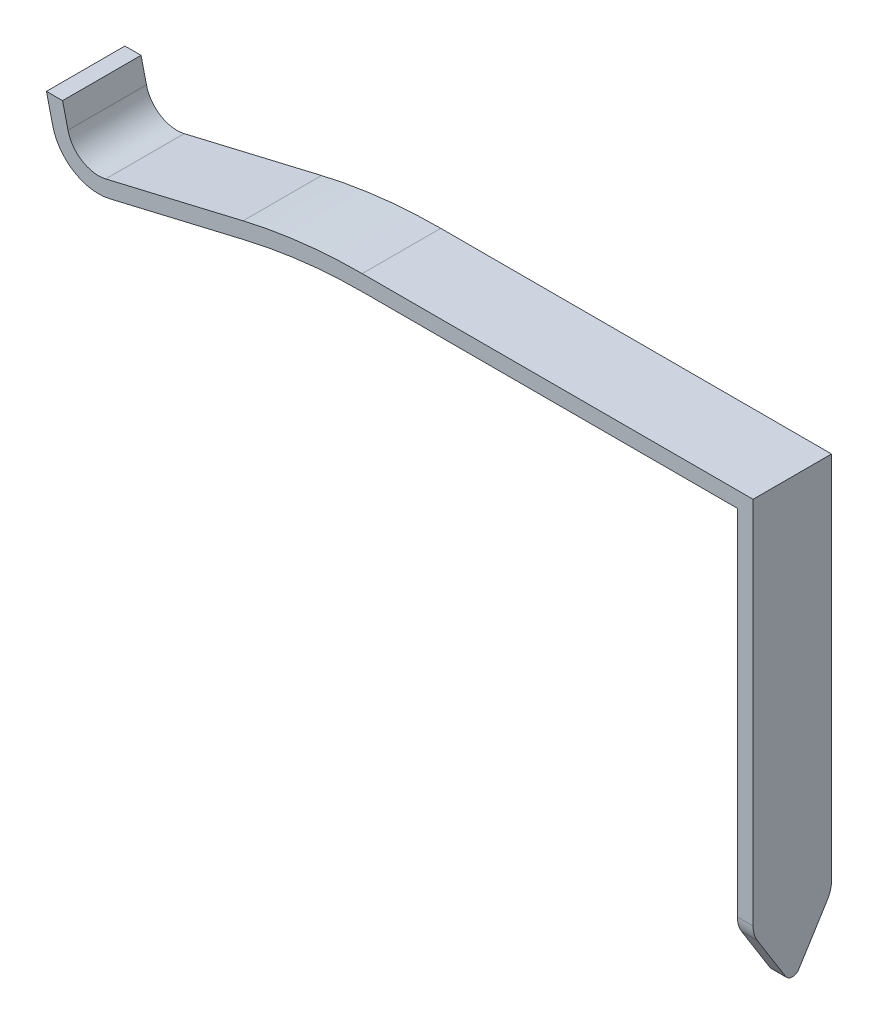
ISO-10303-21;
HEADER;
FILE_DESCRIPTION(('STEP AP214'),'2;1');
FILE_NAME('part.step','',(''),(''),'','','');
FILE_SCHEMA(('AUTOMOTIVE_DESIGN { 1 0 10303 214 1 1 1 1 }'));
ENDSEC;
DATA;
#1=APPLICATION_CONTEXT('core data for automotive mechanical design processes');
#2=APPLICATION_PROTOCOL_DEFINITION('international standard','automotive_design',2000,#1);
#3=PRODUCT_CONTEXT('',#1,'mechanical');
#4=PRODUCT('Part','Part','',(#3));
#5=PRODUCT_RELATED_PRODUCT_CATEGORY('part','',(#4));
#6=PRODUCT_DEFINITION_FORMATION('','',#4);
#7=PRODUCT_DEFINITION_CONTEXT('part definition',#1,'design');
#8=PRODUCT_DEFINITION('design','',#6,#7);
#9=PRODUCT_DEFINITION_SHAPE('','',#8);
#10=(LENGTH_UNIT() NAMED_UNIT(*) SI_UNIT(.MILLI.,.METRE.));
#11=(NAMED_UNIT(*) PLANE_ANGLE_UNIT() SI_UNIT($,.RADIAN.));
#12=(NAMED_UNIT(*) SI_UNIT($,.STERADIAN.) SOLID_ANGLE_UNIT());
#13=UNCERTAINTY_MEASURE_WITH_UNIT(LENGTH_MEASURE(1.E-05),#10,'distance_accuracy_value','');
#14=(GEOMETRIC_REPRESENTATION_CONTEXT(3) GLOBAL_UNCERTAINTY_ASSIGNED_CONTEXT((#13)) GLOBAL_UNIT_ASSIGNED_CONTEXT((#10,
#11,#12)) REPRESENTATION_CONTEXT('',''));
#15=CARTESIAN_POINT('',(0.,0.,0.));
#16=DIRECTION('',(0.,0.,1.));
#17=DIRECTION('',(1.,0.,0.));
#18=AXIS2_PLACEMENT_3D('',#15,#16,#17);
#19=CARTESIAN_POINT('',(-2.28021092385118,1.,0.));
#20=DIRECTION('',(0.,1.,0.));
#21=DIRECTION('',(0.,0.,1.));
#22=AXIS2_PLACEMENT_3D('',#19,#20,#21);
#23=PLANE('',#22);
#24=DIRECTION('',(1.,0.,0.));
#25=VECTOR('',#24,1.);
#26=CARTESIAN_POINT('',(-0.3202200276821,1.,-0.5));
#27=LINE('',#26,#25);
#28=CARTESIAN_POINT('',(2.7,1.,-0.5));
#29=VERTEX_POINT('',#28);
#30=CARTESIAN_POINT('',(-2.28021092385118,1.,-0.5));
#31=VERTEX_POINT('',#30);
#32=EDGE_CURVE('E245',#29,#31,#27,.F.);
#33=ORIENTED_EDGE('',*,*,#32,.T.);
#34=DIRECTION('',(0.,0.,1.));
#35=VECTOR('',#34,1.);
#36=CARTESIAN_POINT('',(-2.28021092385118,1.,0.));
#37=LINE('',#36,#35);
#38=CARTESIAN_POINT('',(-2.28021092385118,1.,0.5));
#39=VERTEX_POINT('',#38);
#40=EDGE_CURVE('E187',#39,#31,#37,.F.);
#41=ORIENTED_EDGE('',*,*,#40,.F.);
#42=DIRECTION('',(1.,0.,0.));
#43=VECTOR('',#42,1.);
#44=CARTESIAN_POINT('',(-0.3202200276821,1.,0.5));
#45=LINE('',#44,#43);
#46=CARTESIAN_POINT('',(2.7,1.,0.5));
#47=VERTEX_POINT('',#46);
#48=EDGE_CURVE('E234',#47,#39,#45,.F.);
#49=ORIENTED_EDGE('',*,*,#48,.F.);
#50=DIRECTION('',(0.,0.,1.));
#51=VECTOR('',#50,1.);
#52=CARTESIAN_POINT('',(2.7,1.,0.));
#53=LINE('',#52,#51);
#54=EDGE_CURVE('E190',#47,#29,#53,.F.);
#55=ORIENTED_EDGE('',*,*,#54,.T.);
#56=EDGE_LOOP('',(#33,#41,#49,#55));
#57=FACE_BOUND('',#56,.T.);
#58=ADVANCED_FACE('F16',(#57),#23,.T.);
#59=CARTESIAN_POINT('',(-2.28021092385118,-5.61694873292272,0.));
#60=DIRECTION('',(0.,0.,1.));
#61=DIRECTION('',(1.,0.,0.));
#62=AXIS2_PLACEMENT_3D('',#59,#60,#61);
#63=CYLINDRICAL_SURFACE('',#62,6.61694873292272);
#64=CARTESIAN_POINT('',(-2.28021092385118,-5.61694873292272,-0.5));
#65=DIRECTION('',(0.,0.,1.));
#66=DIRECTION('',(1.,0.,0.));
#67=AXIS2_PLACEMENT_3D('',#64,#65,#66);
#68=CIRCLE('',#67,6.61694873292272);
#69=CARTESIAN_POINT('',(-3.79920376767955,0.823289715653992,-0.5));
#70=VERTEX_POINT('',#69);
#71=EDGE_CURVE('E243',#31,#70,#68,.T.);
#72=ORIENTED_EDGE('',*,*,#71,.T.);
#73=DIRECTION('',(0.,0.,1.));
#74=VECTOR('',#73,1.);
#75=CARTESIAN_POINT('',(-3.79920376767955,0.823289715653993,0.));
#76=LINE('',#75,#74);
#77=CARTESIAN_POINT('',(-3.79920376767955,0.823289715653992,0.5));
#78=VERTEX_POINT('',#77);
#79=EDGE_CURVE('E184',#78,#70,#76,.F.);
#80=ORIENTED_EDGE('',*,*,#79,.F.);
#81=CARTESIAN_POINT('',(-2.28021092385118,-5.61694873292272,0.5));
#82=DIRECTION('',(0.,0.,1.));
#83=DIRECTION('',(1.,0.,0.));
#84=AXIS2_PLACEMENT_3D('',#81,#82,#83);
#85=CIRCLE('',#84,6.61694873292272);
#86=EDGE_CURVE('E231',#39,#78,#85,.T.);
#87=ORIENTED_EDGE('',*,*,#86,.F.);
#88=ORIENTED_EDGE('',*,*,#40,.T.);
#89=EDGE_LOOP('',(#72,#80,#87,#88));
#90=FACE_BOUND('',#89,.T.);
#91=ADVANCED_FACE('F377',(#90),#63,.T.);
#92=CARTESIAN_POINT('',(-5.54858018365606,0.410682282210637,0.));
#93=DIRECTION('',(-0.229560920771625,0.973294294473405,0.));
#94=DIRECTION('',(-0.973294294473405,-0.229560920771625,0.));
#95=AXIS2_PLACEMENT_3D('',#92,#93,#94);
#96=PLANE('',#95);
#97=DIRECTION('',(-0.973294294473405,-0.229560920771625,0.));
#98=VECTOR('',#97,1.);
#99=CARTESIAN_POINT('',(-3.79920376767955,0.823289715653993,-0.5));
#100=LINE('',#99,#98);
#101=CARTESIAN_POINT('',(-5.54858018365606,0.410682282210637,-0.5));
#102=VERTEX_POINT('',#101);
#103=EDGE_CURVE('E242',#70,#102,#100,.T.);
#104=ORIENTED_EDGE('',*,*,#103,.T.);
#105=DIRECTION('',(0.,0.,1.));
#106=VECTOR('',#105,1.);
#107=CARTESIAN_POINT('',(-5.54858018365606,0.410682282210638,0.));
#108=LINE('',#107,#106);
#109=CARTESIAN_POINT('',(-5.54858018365606,0.410682282210637,0.5));
#110=VERTEX_POINT('',#109);
#111=EDGE_CURVE('E182',#102,#110,#108,.T.);
#112=ORIENTED_EDGE('',*,*,#111,.T.);
#113=DIRECTION('',(-0.973294294473405,-0.229560920771625,0.));
#114=VECTOR('',#113,1.);
#115=CARTESIAN_POINT('',(-3.79920376767955,0.823289715653993,0.5));
#116=LINE('',#115,#114);
#117=EDGE_CURVE('E230',#78,#110,#116,.T.);
#118=ORIENTED_EDGE('',*,*,#117,.F.);
#119=ORIENTED_EDGE('',*,*,#79,.T.);
#120=EDGE_LOOP('',(#104,#112,#118,#119));
#121=FACE_BOUND('',#120,.T.);
#122=ADVANCED_FACE('F374',(#121),#96,.T.);
#123=CARTESIAN_POINT('',(-5.64040455196471,0.8,0.));
#124=DIRECTION('',(0.,0.,1.));
#125=DIRECTION('',(1.,0.,0.));
#126=AXIS2_PLACEMENT_3D('',#123,#124,#125);
#127=CYLINDRICAL_SURFACE('',#126,0.4);
#128=ORIENTED_EDGE('',*,*,#111,.F.);
#129=CARTESIAN_POINT('',(-5.64040455196471,0.8,-0.5));
#130=DIRECTION('',(0.,0.,1.));
#131=DIRECTION('',(1.,0.,0.));
#132=AXIS2_PLACEMENT_3D('',#129,#130,#131);
#133=CIRCLE('',#132,0.4);
#134=CARTESIAN_POINT('',(-6.02972226975407,0.70817563169135,-0.5));
#135=VERTEX_POINT('',#134);
#136=EDGE_CURVE('E240',#102,#135,#133,.F.);
#137=ORIENTED_EDGE('',*,*,#136,.T.);
#138=DIRECTION('',(0.,0.,1.));
#139=VECTOR('',#138,1.);
#140=CARTESIAN_POINT('',(-6.02972226975407,0.708175631691351,0.));
#141=LINE('',#140,#139);
#142=CARTESIAN_POINT('',(-6.02972226975407,0.70817563169135,0.5));
#143=VERTEX_POINT('',#142);
#144=EDGE_CURVE('E177',#143,#135,#141,.F.);
#145=ORIENTED_EDGE('',*,*,#144,.F.);
#146=CARTESIAN_POINT('',(-5.64040455196471,0.8,0.5));
#147=DIRECTION('',(0.,0.,1.));
#148=DIRECTION('',(1.,0.,0.));
#149=AXIS2_PLACEMENT_3D('',#146,#147,#148);
#150=CIRCLE('',#149,0.4);
#151=EDGE_CURVE('E227',#110,#143,#150,.F.);
#152=ORIENTED_EDGE('',*,*,#151,.F.);
#153=EDGE_LOOP('',(#128,#137,#145,#152));
#154=FACE_BOUND('',#153,.T.);
#155=ADVANCED_FACE('F370',(#154),#127,.F.);
#156=CARTESIAN_POINT('',(-6.09855188385222,1.,0.));
#157=DIRECTION('',(0.973294294473405,0.229560920771626,0.));
#158=DIRECTION('',(-0.229560920771626,0.973294294473405,0.));
#159=AXIS2_PLACEMENT_3D('',#156,#157,#158);
#160=PLANE('',#159);
#161=DIRECTION('',(-0.229560920771626,0.973294294473405,0.));
#162=VECTOR('',#161,1.);
#163=CARTESIAN_POINT('',(-6.02972226975407,0.708175631691351,-0.5));
#164=LINE('',#163,#162);
#165=CARTESIAN_POINT('',(-6.09855188385222,1.,-0.5));
#166=VERTEX_POINT('',#165);
#167=EDGE_CURVE('E205',#135,#166,#164,.T.);
#168=ORIENTED_EDGE('',*,*,#167,.T.);
#169=DIRECTION('',(0.,0.,1.));
#170=VECTOR('',#169,1.);
#171=CARTESIAN_POINT('',(-6.09855188385222,1.,0.));
#172=LINE('',#171,#170);
#173=CARTESIAN_POINT('',(-6.09855188385222,1.,0.5));
#174=VERTEX_POINT('',#173);
#175=EDGE_CURVE('E165',#174,#166,#172,.F.);
#176=ORIENTED_EDGE('',*,*,#175,.F.);
#177=DIRECTION('',(-0.229560920771626,0.973294294473405,0.));
#178=VECTOR('',#177,1.);
#179=CARTESIAN_POINT('',(-6.02972226975407,0.708175631691351,0.5));
#180=LINE('',#179,#178);
#181=EDGE_CURVE('E172',#143,#174,#180,.T.);
#182=ORIENTED_EDGE('',*,*,#181,.F.);
#183=ORIENTED_EDGE('',*,*,#144,.T.);
#184=EDGE_LOOP('',(#168,#176,#182,#183));
#185=FACE_BOUND('',#184,.T.);
#186=ADVANCED_FACE('F365',(#185),#160,.T.);
#187=CARTESIAN_POINT('',(-6.30403957769327,1.,0.));
#188=DIRECTION('',(0.,1.,0.));
#189=DIRECTION('',(0.,0.,1.));
#190=AXIS2_PLACEMENT_3D('',#187,#188,#189);
#191=PLANE('',#190);
#192=DIRECTION('',(1.,0.,0.));
#193=VECTOR('',#192,1.);
#194=CARTESIAN_POINT('',(-0.3202200276821,1.,-0.5));
#195=LINE('',#194,#193);
#196=CARTESIAN_POINT('',(-6.30403957769327,1.,-0.5));
#197=VERTEX_POINT('',#196);
#198=EDGE_CURVE('E201',#166,#197,#195,.F.);
#199=ORIENTED_EDGE('',*,*,#198,.T.);
#200=DIRECTION('',(0.,0.,1.));
#201=VECTOR('',#200,1.);
#202=CARTESIAN_POINT('',(-6.30403957769327,1.,0.));
#203=LINE('',#202,#201);
#204=CARTESIAN_POINT('',(-6.30403957769327,1.,0.5));
#205=VERTEX_POINT('',#204);
#206=EDGE_CURVE('E162',#205,#197,#203,.F.);
#207=ORIENTED_EDGE('',*,*,#206,.F.);
#208=DIRECTION('',(1.,0.,0.));
#209=VECTOR('',#208,1.);
#210=CARTESIAN_POINT('',(-0.3202200276821,1.,0.5));
#211=LINE('',#210,#209);
#212=EDGE_CURVE('E168',#174,#205,#211,.F.);
#213=ORIENTED_EDGE('',*,*,#212,.F.);
#214=ORIENTED_EDGE('',*,*,#175,.T.);
#215=EDGE_LOOP('',(#199,#207,#213,#214));
#216=FACE_BOUND('',#215,.T.);
#217=ADVANCED_FACE('F362',(#216),#191,.T.);
#218=CARTESIAN_POINT('',(-6.22438112864875,0.662263447537025,0.));
#219=DIRECTION('',(-0.973294294473407,-0.229560920771619,0.));
#220=DIRECTION('',(0.229560920771619,-0.973294294473407,0.));
#221=AXIS2_PLACEMENT_3D('',#218,#219,#220);
#222=PLANE('',#221);
#223=DIRECTION('',(0.229560920771617,-0.973294294473407,0.));
#224=VECTOR('',#223,1.);
#225=CARTESIAN_POINT('',(-6.30403957769327,1.,-0.5));
#226=LINE('',#225,#224);
#227=CARTESIAN_POINT('',(-6.22438112864875,0.662263447537028,-0.5));
#228=VERTEX_POINT('',#227);
#229=EDGE_CURVE('E204',#197,#228,#226,.T.);
#230=ORIENTED_EDGE('',*,*,#229,.T.);
#231=DIRECTION('',(0.,0.,1.));
#232=VECTOR('',#231,1.);
#233=CARTESIAN_POINT('',(-6.22438112864875,0.662263447537025,0.));
#234=LINE('',#233,#232);
#235=CARTESIAN_POINT('',(-6.22438112864875,0.662263447537028,0.5));
#236=VERTEX_POINT('',#235);
#237=EDGE_CURVE('E159',#236,#228,#234,.F.);
#238=ORIENTED_EDGE('',*,*,#237,.F.);
#239=DIRECTION('',(0.229560920771617,-0.973294294473407,0.));
#240=VECTOR('',#239,1.);
#241=CARTESIAN_POINT('',(-6.30403957769327,1.,0.5));
#242=LINE('',#241,#240);
#243=EDGE_CURVE('E171',#205,#236,#242,.T.);
#244=ORIENTED_EDGE('',*,*,#243,.F.);
#245=ORIENTED_EDGE('',*,*,#206,.T.);
#246=EDGE_LOOP('',(#230,#238,#244,#245));
#247=FACE_BOUND('',#246,.T.);
#248=ADVANCED_FACE('F358',(#247),#222,.T.);
#249=CARTESIAN_POINT('',(-5.64040455196471,0.8,0.));
#250=DIRECTION('',(0.,0.,1.));
#251=DIRECTION('',(1.,0.,0.));
#252=AXIS2_PLACEMENT_3D('',#249,#250,#251);
#253=CYLINDRICAL_SURFACE('',#252,0.6);
#254=CARTESIAN_POINT('',(-5.64040455196471,0.8,-0.5));
#255=DIRECTION('',(0.,0.,1.));
#256=DIRECTION('',(1.,0.,0.));
#257=AXIS2_PLACEMENT_3D('',#254,#255,#256);
#258=CIRCLE('',#257,0.6);
#259=CARTESIAN_POINT('',(-5.50266799950174,0.216023423315956,-0.5));
#260=VERTEX_POINT('',#259);
#261=EDGE_CURVE('E238',#228,#260,#258,.T.);
#262=ORIENTED_EDGE('',*,*,#261,.T.);
#263=DIRECTION('',(0.,0.,1.));
#264=VECTOR('',#263,1.);
#265=CARTESIAN_POINT('',(-5.50266799950174,0.216023423315956,0.));
#266=LINE('',#265,#264);
#267=CARTESIAN_POINT('',(-5.50266799950174,0.216023423315956,0.5));
#268=VERTEX_POINT('',#267);
#269=EDGE_CURVE('E156',#268,#260,#266,.F.);
#270=ORIENTED_EDGE('',*,*,#269,.F.);
#271=CARTESIAN_POINT('',(-5.64040455196471,0.8,0.5));
#272=DIRECTION('',(0.,0.,1.));
#273=DIRECTION('',(1.,0.,0.));
#274=AXIS2_PLACEMENT_3D('',#271,#272,#273);
#275=CIRCLE('',#274,0.6);
#276=EDGE_CURVE('E224',#236,#268,#275,.T.);
#277=ORIENTED_EDGE('',*,*,#276,.F.);
#278=ORIENTED_EDGE('',*,*,#237,.T.);
#279=EDGE_LOOP('',(#262,#270,#277,#278));
#280=FACE_BOUND('',#279,.T.);
#281=ADVANCED_FACE('F353',(#280),#253,.T.);
#282=CARTESIAN_POINT('',(-3.7740451176535,0.623735933989494,0.));
#283=DIRECTION('',(0.229560920771625,-0.973294294473405,0.));
#284=DIRECTION('',(0.973294294473405,0.229560920771625,0.));
#285=AXIS2_PLACEMENT_3D('',#282,#283,#284);
#286=PLANE('',#285);
#287=DIRECTION('',(0.973294294473405,0.229560920771625,0.));
#288=VECTOR('',#287,1.);
#289=CARTESIAN_POINT('',(-5.50266799950174,0.216023423315956,-0.5));
#290=LINE('',#289,#288);
#291=CARTESIAN_POINT('',(-3.7740451176535,0.623735933989495,-0.5));
#292=VERTEX_POINT('',#291);
#293=EDGE_CURVE('E237',#260,#292,#290,.T.);
#294=ORIENTED_EDGE('',*,*,#293,.T.);
#295=DIRECTION('',(0.,0.,1.));
#296=VECTOR('',#295,1.);
#297=CARTESIAN_POINT('',(-3.7740451176535,0.623735933989495,0.));
#298=LINE('',#297,#296);
#299=CARTESIAN_POINT('',(-3.7740451176535,0.623735933989495,0.5));
#300=VERTEX_POINT('',#299);
#301=EDGE_CURVE('E146',#292,#300,#298,.T.);
#302=ORIENTED_EDGE('',*,*,#301,.T.);
#303=DIRECTION('',(0.973294294473405,0.229560920771625,0.));
#304=VECTOR('',#303,1.);
#305=CARTESIAN_POINT('',(-5.50266799950174,0.216023423315956,0.5));
#306=LINE('',#305,#304);
#307=EDGE_CURVE('E223',#268,#300,#306,.T.);
#308=ORIENTED_EDGE('',*,*,#307,.F.);
#309=ORIENTED_EDGE('',*,*,#269,.T.);
#310=EDGE_LOOP('',(#294,#302,#308,#309));
#311=FACE_BOUND('',#310,.T.);
#312=ADVANCED_FACE('F350',(#311),#286,.T.);
#313=CARTESIAN_POINT('',(-2.25888794451583,-5.80024000620294,0.));
#314=DIRECTION('',(0.,0.,1.));
#315=DIRECTION('',(1.,0.,0.));
#316=AXIS2_PLACEMENT_3D('',#313,#314,#315);
#317=CYLINDRICAL_SURFACE('',#316,6.60024000620294);
#318=ORIENTED_EDGE('',*,*,#301,.F.);
#319=CARTESIAN_POINT('',(-2.25888794451583,-5.80024000620294,-0.5));
#320=DIRECTION('',(0.,0.,1.));
#321=DIRECTION('',(1.,0.,0.));
#322=AXIS2_PLACEMENT_3D('',#319,#320,#321);
#323=CIRCLE('',#322,6.60024000620294);
#324=CARTESIAN_POINT('',(-2.25888794451583,0.8,-0.5));
#325=VERTEX_POINT('',#324);
#326=EDGE_CURVE('E235',#292,#325,#323,.F.);
#327=ORIENTED_EDGE('',*,*,#326,.T.);
#328=DIRECTION('',(0.,0.,-1.));
#329=VECTOR('',#328,1.);
#330=CARTESIAN_POINT('',(-2.25888794451583,0.8,0.));
#331=LINE('',#330,#329);
#332=CARTESIAN_POINT('',(-2.25888794451583,0.8,0.5));
#333=VERTEX_POINT('',#332);
#334=EDGE_CURVE('E143',#333,#325,#331,.T.);
#335=ORIENTED_EDGE('',*,*,#334,.F.);
#336=CARTESIAN_POINT('',(-2.25888794451583,-5.80024000620294,0.5));
#337=DIRECTION('',(0.,0.,1.));
#338=DIRECTION('',(1.,0.,0.));
#339=AXIS2_PLACEMENT_3D('',#336,#337,#338);
#340=CIRCLE('',#339,6.60024000620294);
#341=EDGE_CURVE('E219',#300,#333,#340,.F.);
#342=ORIENTED_EDGE('',*,*,#341,.F.);
#343=EDGE_LOOP('',(#318,#327,#335,#342));
#344=FACE_BOUND('',#343,.T.);
#345=ADVANCED_FACE('F346',(#344),#317,.F.);
#346=CARTESIAN_POINT('',(2.5,0.8,0.));
#347=DIRECTION('',(0.,-1.,0.));
#348=DIRECTION('',(0.,0.,-1.));
#349=AXIS2_PLACEMENT_3D('',#346,#347,#348);
#350=PLANE('',#349);
#351=DIRECTION('',(1.,0.,0.));
#352=VECTOR('',#351,1.);
#353=CARTESIAN_POINT('',(-0.3202200276821,0.8,-0.5));
#354=LINE('',#353,#352);
#355=CARTESIAN_POINT('',(2.5,0.8,-0.5));
#356=VERTEX_POINT('',#355);
#357=EDGE_CURVE('E198',#325,#356,#354,.T.);
#358=ORIENTED_EDGE('',*,*,#357,.T.);
#359=DIRECTION('',(0.,0.,1.));
#360=VECTOR('',#359,1.);
#361=CARTESIAN_POINT('',(2.5,0.8,0.));
#362=LINE('',#361,#360);
#363=CARTESIAN_POINT('',(2.5,0.8,0.5));
#364=VERTEX_POINT('',#363);
#365=EDGE_CURVE('E150',#364,#356,#362,.F.);
#366=ORIENTED_EDGE('',*,*,#365,.F.);
#367=DIRECTION('',(1.,0.,0.));
#368=VECTOR('',#367,1.);
#369=CARTESIAN_POINT('',(-0.3202200276821,0.8,0.5));
#370=LINE('',#369,#368);
#371=EDGE_CURVE('E222',#333,#364,#370,.T.);
#372=ORIENTED_EDGE('',*,*,#371,.F.);
#373=ORIENTED_EDGE('',*,*,#334,.T.);
#374=EDGE_LOOP('',(#358,#366,#372,#373));
#375=FACE_BOUND('',#374,.T.);
#376=ADVANCED_FACE('F340',(#375),#350,.T.);
#377=CARTESIAN_POINT('',(2.5,-4.61,0.));
#378=DIRECTION('',(-1.,0.,0.));
#379=DIRECTION('',(0.,0.,1.));
#380=AXIS2_PLACEMENT_3D('',#377,#378,#379);
#381=PLANE('',#380);
#382=ORIENTED_EDGE('',*,*,#365,.T.);
#383=DIRECTION('',(0.,1.,0.));
#384=VECTOR('',#383,1.);
#385=CARTESIAN_POINT('',(2.5,-0.224915035415514,-0.5));
#386=LINE('',#385,#384);
#387=CARTESIAN_POINT('',(2.5,-3.70962132075604,-0.5));
#388=VERTEX_POINT('',#387);
#389=EDGE_CURVE('E195',#356,#388,#386,.F.);
#390=ORIENTED_EDGE('',*,*,#389,.T.);
#391=CARTESIAN_POINT('',(2.5,-3.70962132075604,-0.15));
#392=DIRECTION('',(-1.,0.,0.));
#393=DIRECTION('',(0.,0.,1.));
#394=AXIS2_PLACEMENT_3D('',#391,#392,#393);
#395=CIRCLE('',#394,0.35);
#396=CARTESIAN_POINT('',(2.5,-3.89512094975715,-0.446799406401781));
#397=VERTEX_POINT('',#396);
#398=EDGE_CURVE('E152',#397,#388,#395,.F.);
#399=ORIENTED_EDGE('',*,*,#398,.F.);
#400=DIRECTION('',(0.,-0.847998304005088,0.52999894000318));
#401=VECTOR('',#400,1.);
#402=CARTESIAN_POINT('',(2.5,-3.89512094975715,-0.446799406401781));
#403=LINE('',#402,#401);
#404=CARTESIAN_POINT('',(2.5,-4.47432027135919,-0.0847998304005089));
#405=VERTEX_POINT('',#404);
#406=EDGE_CURVE('E142',#397,#405,#403,.T.);
#407=ORIENTED_EDGE('',*,*,#406,.T.);
#408=CARTESIAN_POINT('',(2.5,-4.42132037735887,0.));
#409=DIRECTION('',(-1.,0.,0.));
#410=DIRECTION('',(0.,0.,1.));
#411=AXIS2_PLACEMENT_3D('',#408,#409,#410);
#412=CIRCLE('',#411,0.1);
#413=CARTESIAN_POINT('',(2.5,-4.47432027135919,0.0847998304005086));
#414=VERTEX_POINT('',#413);
#415=EDGE_CURVE('E19',#405,#414,#412,.T.);
#416=ORIENTED_EDGE('',*,*,#415,.T.);
#417=DIRECTION('',(0.,0.847998304005088,0.52999894000318));
#418=VECTOR('',#417,1.);
#419=CARTESIAN_POINT('',(2.5,-4.47432027135919,0.084799830400509));
#420=LINE('',#419,#418);
#421=CARTESIAN_POINT('',(2.5,-3.89512094975715,0.446799406401781));
#422=VERTEX_POINT('',#421);
#423=EDGE_CURVE('E126',#414,#422,#420,.T.);
#424=ORIENTED_EDGE('',*,*,#423,.T.);
#425=CARTESIAN_POINT('',(2.5,-3.70962132075604,0.15));
#426=DIRECTION('',(1.,0.,0.));
#427=DIRECTION('',(0.,0.,-1.));
#428=AXIS2_PLACEMENT_3D('',#425,#426,#427);
#429=CIRCLE('',#428,0.35);
#430=CARTESIAN_POINT('',(2.5,-3.70962132075604,0.5));
#431=VERTEX_POINT('',#430);
#432=EDGE_CURVE('E132',#422,#431,#429,.F.);
#433=ORIENTED_EDGE('',*,*,#432,.T.);
#434=DIRECTION('',(0.,1.,0.));
#435=VECTOR('',#434,1.);
#436=CARTESIAN_POINT('',(2.5,-0.224915035415514,0.5));
#437=LINE('',#436,#435);
#438=EDGE_CURVE('E249',#364,#431,#437,.F.);
#439=ORIENTED_EDGE('',*,*,#438,.F.);
#440=EDGE_LOOP('',(#382,#390,#399,#407,#416,#424,#433,#439));
#441=FACE_BOUND('',#440,.T.);
#442=ADVANCED_FACE('F140',(#441),#381,.T.);
#443=CARTESIAN_POINT('',(1.08988998615895,-3.70962132075604,-0.15));
#444=DIRECTION('',(-1.,0.,0.));
#445=DIRECTION('',(0.,0.,1.));
#446=AXIS2_PLACEMENT_3D('',#443,#444,#445);
#447=CYLINDRICAL_SURFACE('',#446,0.35);
#448=CARTESIAN_POINT('',(2.7,-3.70962132075604,-0.15));
#449=DIRECTION('',(-1.,0.,0.));
#450=DIRECTION('',(0.,0.,1.));
#451=AXIS2_PLACEMENT_3D('',#448,#449,#450);
#452=CIRCLE('',#451,0.35);
#453=CARTESIAN_POINT('',(2.7,-3.89512094975715,-0.446799406401781));
#454=VERTEX_POINT('',#453);
#455=CARTESIAN_POINT('',(2.7,-3.70962132075604,-0.5));
#456=VERTEX_POINT('',#455);
#457=EDGE_CURVE('E214',#454,#456,#452,.F.);
#458=ORIENTED_EDGE('',*,*,#457,.F.);
#459=DIRECTION('',(1.,0.,0.));
#460=VECTOR('',#459,1.);
#461=CARTESIAN_POINT('',(2.5,-3.89512094975715,-0.446799406401781));
#462=LINE('',#461,#460);
#463=EDGE_CURVE('E218',#454,#397,#462,.F.);
#464=ORIENTED_EDGE('',*,*,#463,.T.);
#465=ORIENTED_EDGE('',*,*,#398,.T.);
#466=DIRECTION('',(1.,0.,0.));
#467=VECTOR('',#466,1.);
#468=CARTESIAN_POINT('',(-0.3202200276821,-3.70962132075604,-0.5));
#469=LINE('',#468,#467);
#470=EDGE_CURVE('E197',#388,#456,#469,.T.);
#471=ORIENTED_EDGE('',*,*,#470,.T.);
#472=EDGE_LOOP('',(#458,#464,#465,#471));
#473=FACE_BOUND('',#472,.T.);
#474=ADVANCED_FACE('F304',(#473),#447,.T.);
#475=CARTESIAN_POINT('',(-0.3202200276821,-0.224915035415514,-0.5));
#476=DIRECTION('',(0.,0.,1.));
#477=DIRECTION('',(1.,0.,0.));
#478=AXIS2_PLACEMENT_3D('',#475,#476,#477);
#479=PLANE('',#478);
#480=ORIENTED_EDGE('',*,*,#389,.F.);
#481=ORIENTED_EDGE('',*,*,#357,.F.);
#482=ORIENTED_EDGE('',*,*,#326,.F.);
#483=ORIENTED_EDGE('',*,*,#293,.F.);
#484=ORIENTED_EDGE('',*,*,#261,.F.);
#485=ORIENTED_EDGE('',*,*,#229,.F.);
#486=ORIENTED_EDGE('',*,*,#198,.F.);
#487=ORIENTED_EDGE('',*,*,#167,.F.);
#488=ORIENTED_EDGE('',*,*,#136,.F.);
#489=ORIENTED_EDGE('',*,*,#103,.F.);
#490=ORIENTED_EDGE('',*,*,#71,.F.);
#491=ORIENTED_EDGE('',*,*,#32,.F.);
#492=DIRECTION('',(0.,1.,0.));
#493=VECTOR('',#492,1.);
#494=CARTESIAN_POINT('',(2.7,1.,-0.5));
#495=LINE('',#494,#493);
#496=EDGE_CURVE('E217',#456,#29,#495,.T.);
#497=ORIENTED_EDGE('',*,*,#496,.F.);
#498=ORIENTED_EDGE('',*,*,#470,.F.);
#499=EDGE_LOOP('',(#480,#481,#482,#483,#484,#485,#486,#487,#488,#489,#490,#491,#497,#498));
#500=FACE_BOUND('',#499,.T.);
#501=ADVANCED_FACE('F311',(#500),#479,.F.);
#502=CARTESIAN_POINT('',(-0.3202200276821,-0.224915035415514,0.5));
#503=DIRECTION('',(0.,0.,1.));
#504=DIRECTION('',(1.,0.,0.));
#505=AXIS2_PLACEMENT_3D('',#502,#503,#504);
#506=PLANE('',#505);
#507=ORIENTED_EDGE('',*,*,#371,.T.);
#508=ORIENTED_EDGE('',*,*,#438,.T.);
#509=DIRECTION('',(1.,0.,0.));
#510=VECTOR('',#509,1.);
#511=CARTESIAN_POINT('',(1.08988998615895,-3.70962132075604,0.5));
#512=LINE('',#511,#510);
#513=CARTESIAN_POINT('',(2.7,-3.70962132075604,0.5));
#514=VERTEX_POINT('',#513);
#515=EDGE_CURVE('E256',#514,#431,#512,.F.);
#516=ORIENTED_EDGE('',*,*,#515,.F.);
#517=DIRECTION('',(0.,1.,0.));
#518=VECTOR('',#517,1.);
#519=CARTESIAN_POINT('',(2.7,1.,0.5));
#520=LINE('',#519,#518);
#521=EDGE_CURVE('E213',#47,#514,#520,.F.);
#522=ORIENTED_EDGE('',*,*,#521,.F.);
#523=ORIENTED_EDGE('',*,*,#48,.T.);
#524=ORIENTED_EDGE('',*,*,#86,.T.);
#525=ORIENTED_EDGE('',*,*,#117,.T.);
#526=ORIENTED_EDGE('',*,*,#151,.T.);
#527=ORIENTED_EDGE('',*,*,#181,.T.);
#528=ORIENTED_EDGE('',*,*,#212,.T.);
#529=ORIENTED_EDGE('',*,*,#243,.T.);
#530=ORIENTED_EDGE('',*,*,#276,.T.);
#531=ORIENTED_EDGE('',*,*,#307,.T.);
#532=ORIENTED_EDGE('',*,*,#341,.T.);
#533=EDGE_LOOP('',(#507,#508,#516,#522,#523,#524,#525,#526,#527,#528,#529,#530,#531,#532));
#534=FACE_BOUND('',#533,.T.);
#535=ADVANCED_FACE('F254',(#534),#506,.T.);
#536=CARTESIAN_POINT('',(1.08988998615895,-3.70962132075604,0.15));
#537=DIRECTION('',(1.,0.,0.));
#538=DIRECTION('',(0.,0.,-1.));
#539=AXIS2_PLACEMENT_3D('',#536,#537,#538);
#540=CYLINDRICAL_SURFACE('',#539,0.35);
#541=ORIENTED_EDGE('',*,*,#432,.F.);
#542=DIRECTION('',(1.,0.,0.));
#543=VECTOR('',#542,1.);
#544=CARTESIAN_POINT('',(2.5,-3.89512094975715,0.446799406401781));
#545=LINE('',#544,#543);
#546=CARTESIAN_POINT('',(2.7,-3.89512094975715,0.446799406401781));
#547=VERTEX_POINT('',#546);
#548=EDGE_CURVE('E130',#422,#547,#545,.T.);
#549=ORIENTED_EDGE('',*,*,#548,.T.);
#550=CARTESIAN_POINT('',(2.7,-3.70962132075604,0.15));
#551=DIRECTION('',(1.,0.,0.));
#552=DIRECTION('',(0.,0.,-1.));
#553=AXIS2_PLACEMENT_3D('',#550,#551,#552);
#554=CIRCLE('',#553,0.35);
#555=EDGE_CURVE('E210',#514,#547,#554,.T.);
#556=ORIENTED_EDGE('',*,*,#555,.F.);
#557=ORIENTED_EDGE('',*,*,#515,.T.);
#558=EDGE_LOOP('',(#541,#549,#556,#557));
#559=FACE_BOUND('',#558,.T.);
#560=ADVANCED_FACE('F260',(#559),#540,.T.);
#561=CARTESIAN_POINT('',(2.5,-3.81,0.5));
#562=DIRECTION('',(0.,0.52999894000318,-0.847998304005088));
#563=DIRECTION('',(0.,0.847998304005088,0.52999894000318));
#564=AXIS2_PLACEMENT_3D('',#561,#562,#563);
#565=PLANE('',#564);
#566=ORIENTED_EDGE('',*,*,#423,.F.);
#567=DIRECTION('',(-1.,0.,0.));
#568=VECTOR('',#567,1.);
#569=CARTESIAN_POINT('',(2.5,-4.47432027135919,0.0847998304005083));
#570=LINE('',#569,#568);
#571=CARTESIAN_POINT('',(2.7,-4.47432027135919,0.0847998304005084));
#572=VERTEX_POINT('',#571);
#573=EDGE_CURVE('E129',#572,#414,#570,.T.);
#574=ORIENTED_EDGE('',*,*,#573,.F.);
#575=DIRECTION('',(0.,-0.847998304005087,-0.529998940003181));
#576=VECTOR('',#575,1.);
#577=CARTESIAN_POINT('',(2.7,-3.89512094975715,0.446799406401781));
#578=LINE('',#577,#576);
#579=EDGE_CURVE('E209',#547,#572,#578,.T.);
#580=ORIENTED_EDGE('',*,*,#579,.F.);
#581=ORIENTED_EDGE('',*,*,#548,.F.);
#582=EDGE_LOOP('',(#566,#574,#580,#581));
#583=FACE_BOUND('',#582,.T.);
#584=ADVANCED_FACE('F127',(#583),#565,.F.);
#585=CARTESIAN_POINT('',(2.5,-4.42132037735887,0.));
#586=DIRECTION('',(-1.,0.,0.));
#587=DIRECTION('',(0.,0.,1.));
#588=AXIS2_PLACEMENT_3D('',#585,#586,#587);
#589=CYLINDRICAL_SURFACE('',#588,0.1);
#590=CARTESIAN_POINT('',(2.7,-4.42132037735887,0.));
#591=DIRECTION('',(-1.,0.,0.));
#592=DIRECTION('',(0.,0.,1.));
#593=AXIS2_PLACEMENT_3D('',#590,#591,#592);
#594=CIRCLE('',#593,0.1);
#595=CARTESIAN_POINT('',(2.7,-4.47432027135919,-0.0847998304005088));
#596=VERTEX_POINT('',#595);
#597=EDGE_CURVE('E25',#572,#596,#594,.F.);
#598=ORIENTED_EDGE('',*,*,#597,.F.);
#599=ORIENTED_EDGE('',*,*,#573,.T.);
#600=ORIENTED_EDGE('',*,*,#415,.F.);
#601=DIRECTION('',(1.,0.,0.));
#602=VECTOR('',#601,1.);
#603=CARTESIAN_POINT('',(2.5,-4.47432027135919,-0.0847998304005088));
#604=LINE('',#603,#602);
#605=EDGE_CURVE('E34',#405,#596,#604,.T.);
#606=ORIENTED_EDGE('',*,*,#605,.T.);
#607=EDGE_LOOP('',(#598,#599,#600,#606));
#608=FACE_BOUND('',#607,.T.);
#609=ADVANCED_FACE('F134',(#608),#589,.T.);
#610=CARTESIAN_POINT('',(2.5,-4.61,0.));
#611=DIRECTION('',(0.,0.52999894000318,0.847998304005088));
#612=DIRECTION('',(0.,-0.847998304005088,0.52999894000318));
#613=AXIS2_PLACEMENT_3D('',#610,#611,#612);
#614=PLANE('',#613);
#615=DIRECTION('',(0.,0.847998304005088,-0.52999894000318));
#616=VECTOR('',#615,1.);
#617=CARTESIAN_POINT('',(2.7,-4.47432027135919,-0.084799830400509));
#618=LINE('',#617,#616);
#619=EDGE_CURVE('E11',#596,#454,#618,.T.);
#620=ORIENTED_EDGE('',*,*,#619,.F.);
#621=ORIENTED_EDGE('',*,*,#605,.F.);
#622=ORIENTED_EDGE('',*,*,#406,.F.);
#623=ORIENTED_EDGE('',*,*,#463,.F.);
#624=EDGE_LOOP('',(#620,#621,#622,#623));
#625=FACE_BOUND('',#624,.T.);
#626=ADVANCED_FACE('F318',(#625),#614,.F.);
#627=CARTESIAN_POINT('',(2.7,1.,0.));
#628=DIRECTION('',(1.,0.,0.));
#629=DIRECTION('',(0.,0.,-1.));
#630=AXIS2_PLACEMENT_3D('',#627,#628,#629);
#631=PLANE('',#630);
#632=ORIENTED_EDGE('',*,*,#597,.T.);
#633=ORIENTED_EDGE('',*,*,#619,.T.);
#634=ORIENTED_EDGE('',*,*,#457,.T.);
#635=ORIENTED_EDGE('',*,*,#496,.T.);
#636=ORIENTED_EDGE('',*,*,#54,.F.);
#637=ORIENTED_EDGE('',*,*,#521,.T.);
#638=ORIENTED_EDGE('',*,*,#555,.T.);
#639=ORIENTED_EDGE('',*,*,#579,.T.);
#640=EDGE_LOOP('',(#632,#633,#634,#635,#636,#637,#638,#639));
#641=FACE_BOUND('',#640,.T.);
#642=ADVANCED_FACE('F316',(#641),#631,.T.);
#643=CLOSED_SHELL('',(#58,#91,#122,#155,#186,#217,#248,#281,#312,#345,#376,#442,#474,#501,#535,
#560,#584,#609,#626,#642));
#644=MANIFOLD_SOLID_BREP('B1',#643);
#645=ADVANCED_BREP_SHAPE_REPRESENTATION('',(#18,#644),#14);
#646=SHAPE_DEFINITION_REPRESENTATION(#9,#645);
ENDSEC;
END-ISO-10303-21;
